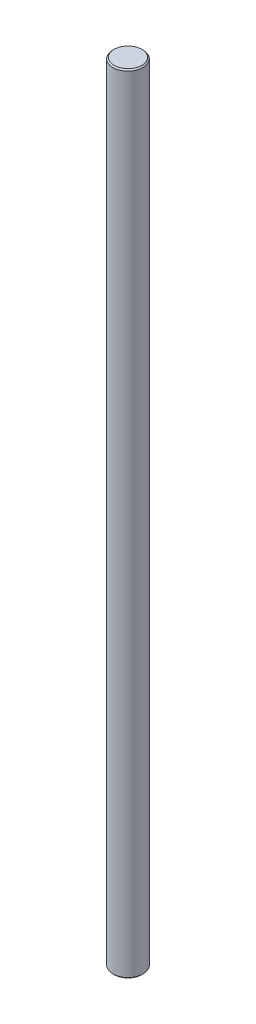
ISO-10303-21;
HEADER;
FILE_DESCRIPTION(('STEP AP214'),'2;1');
FILE_NAME('part.step','',(''),(''),'','','');
FILE_SCHEMA(('AUTOMOTIVE_DESIGN { 1 0 10303 214 1 1 1 1 }'));
ENDSEC;
DATA;
#1=APPLICATION_CONTEXT('core data for automotive mechanical design processes');
#2=APPLICATION_PROTOCOL_DEFINITION('international standard','automotive_design',2000,#1);
#3=PRODUCT_CONTEXT('',#1,'mechanical');
#4=PRODUCT('Part','Part','',(#3));
#5=PRODUCT_RELATED_PRODUCT_CATEGORY('part','',(#4));
#6=PRODUCT_DEFINITION_FORMATION('','',#4);
#7=PRODUCT_DEFINITION_CONTEXT('part definition',#1,'design');
#8=PRODUCT_DEFINITION('design','',#6,#7);
#9=PRODUCT_DEFINITION_SHAPE('','',#8);
#10=(LENGTH_UNIT() NAMED_UNIT(*) SI_UNIT(.MILLI.,.METRE.));
#11=(NAMED_UNIT(*) PLANE_ANGLE_UNIT() SI_UNIT($,.RADIAN.));
#12=(NAMED_UNIT(*) SI_UNIT($,.STERADIAN.) SOLID_ANGLE_UNIT());
#13=UNCERTAINTY_MEASURE_WITH_UNIT(LENGTH_MEASURE(1.E-05),#10,'distance_accuracy_value','');
#14=(GEOMETRIC_REPRESENTATION_CONTEXT(3) GLOBAL_UNCERTAINTY_ASSIGNED_CONTEXT((#13)) GLOBAL_UNIT_ASSIGNED_CONTEXT((#10,
#11,#12)) REPRESENTATION_CONTEXT('',''));
#15=CARTESIAN_POINT('',(0.,0.,0.));
#16=DIRECTION('',(0.,0.,1.));
#17=DIRECTION('',(1.,0.,0.));
#18=AXIS2_PLACEMENT_3D('',#15,#16,#17);
#19=CARTESIAN_POINT('',(0.,312.,0.));
#20=DIRECTION('',(0.,-1.,0.));
#21=DIRECTION('',(0.,0.,-1.));
#22=AXIS2_PLACEMENT_3D('',#19,#20,#21);
#23=CYLINDRICAL_SURFACE('',#22,6.);
#24=CARTESIAN_POINT('',(0.,311.5,0.));
#25=DIRECTION('',(0.,1.,0.));
#26=DIRECTION('',(0.,0.,1.));
#27=AXIS2_PLACEMENT_3D('',#24,#25,#26);
#28=CIRCLE('',#27,6.);
#29=CARTESIAN_POINT('',(0.,311.5,6.));
#30=VERTEX_POINT('',#29);
#31=EDGE_CURVE('E51',#30,#30,#28,.F.);
#32=ORIENTED_EDGE('',*,*,#31,.T.);
#33=EDGE_LOOP('',(#32));
#34=FACE_BOUND('',#33,.T.);
#35=CARTESIAN_POINT('',(0.,0.5,0.));
#36=DIRECTION('',(0.,1.,0.));
#37=DIRECTION('',(0.,0.,1.));
#38=AXIS2_PLACEMENT_3D('',#35,#36,#37);
#39=CIRCLE('',#38,6.);
#40=CARTESIAN_POINT('',(0.,0.5,6.));
#41=VERTEX_POINT('',#40);
#42=EDGE_CURVE('E55',#41,#41,#39,.T.);
#43=ORIENTED_EDGE('',*,*,#42,.T.);
#44=EDGE_LOOP('',(#43));
#45=FACE_BOUND('',#44,.T.);
#46=ADVANCED_FACE('F44',(#34,#45),#23,.T.);
#47=CARTESIAN_POINT('',(0.,312.,0.));
#48=DIRECTION('',(0.,1.,0.));
#49=DIRECTION('',(0.,0.,1.));
#50=AXIS2_PLACEMENT_3D('',#47,#48,#49);
#51=PLANE('',#50);
#52=CARTESIAN_POINT('',(0.,312.,0.));
#53=DIRECTION('',(0.,1.,0.));
#54=DIRECTION('',(0.,0.,1.));
#55=AXIS2_PLACEMENT_3D('',#52,#53,#54);
#56=CIRCLE('',#55,5.49999999999998);
#57=CARTESIAN_POINT('',(0.,312.,5.49999999999998));
#58=VERTEX_POINT('',#57);
#59=EDGE_CURVE('E59',#58,#58,#56,.T.);
#60=ORIENTED_EDGE('',*,*,#59,.T.);
#61=EDGE_LOOP('',(#60));
#62=FACE_BOUND('',#61,.T.);
#63=ADVANCED_FACE('F65',(#62),#51,.T.);
#64=CARTESIAN_POINT('',(0.,0.,0.));
#65=DIRECTION('',(0.,1.,0.));
#66=DIRECTION('',(0.,0.,1.));
#67=AXIS2_PLACEMENT_3D('',#64,#65,#66);
#68=PLANE('',#67);
#69=CARTESIAN_POINT('',(0.,0.,0.));
#70=DIRECTION('',(0.,1.,0.));
#71=DIRECTION('',(0.,0.,1.));
#72=AXIS2_PLACEMENT_3D('',#69,#70,#71);
#73=CIRCLE('',#72,5.50000000000001);
#74=CARTESIAN_POINT('',(0.,0.,5.50000000000001));
#75=VERTEX_POINT('',#74);
#76=EDGE_CURVE('E12',#75,#75,#73,.F.);
#77=ORIENTED_EDGE('',*,*,#76,.T.);
#78=EDGE_LOOP('',(#77));
#79=FACE_BOUND('',#78,.T.);
#80=ADVANCED_FACE('F69',(#79),#68,.F.);
#81=CARTESIAN_POINT('',(0.,312.,0.));
#82=DIRECTION('',(0.,-1.,0.));
#83=DIRECTION('',(0.,0.,-1.));
#84=AXIS2_PLACEMENT_3D('',#81,#82,#83);
#85=CONICAL_SURFACE('',#84,5.49999999999998,0.785398163397472);
#86=ORIENTED_EDGE('',*,*,#31,.F.);
#87=EDGE_LOOP('',(#86));
#88=FACE_BOUND('',#87,.T.);
#89=ORIENTED_EDGE('',*,*,#59,.F.);
#90=EDGE_LOOP('',(#89));
#91=FACE_BOUND('',#90,.T.);
#92=ADVANCED_FACE('F67',(#88,#91),#85,.T.);
#93=CARTESIAN_POINT('',(0.,0.5,0.));
#94=DIRECTION('',(0.,1.,0.));
#95=DIRECTION('',(0.,0.,1.));
#96=AXIS2_PLACEMENT_3D('',#93,#94,#95);
#97=CONICAL_SURFACE('',#96,6.,0.785398163397443);
#98=ORIENTED_EDGE('',*,*,#76,.F.);
#99=EDGE_LOOP('',(#98));
#100=FACE_BOUND('',#99,.T.);
#101=ORIENTED_EDGE('',*,*,#42,.F.);
#102=EDGE_LOOP('',(#101));
#103=FACE_BOUND('',#102,.T.);
#104=ADVANCED_FACE('F46',(#100,#103),#97,.T.);
#105=CLOSED_SHELL('',(#46,#63,#80,#92,#104));
#106=MANIFOLD_SOLID_BREP('B2',#105);
#107=ADVANCED_BREP_SHAPE_REPRESENTATION('',(#18,#106),#14);
#108=SHAPE_DEFINITION_REPRESENTATION(#9,#107);
ENDSEC;
END-ISO-10303-21;
